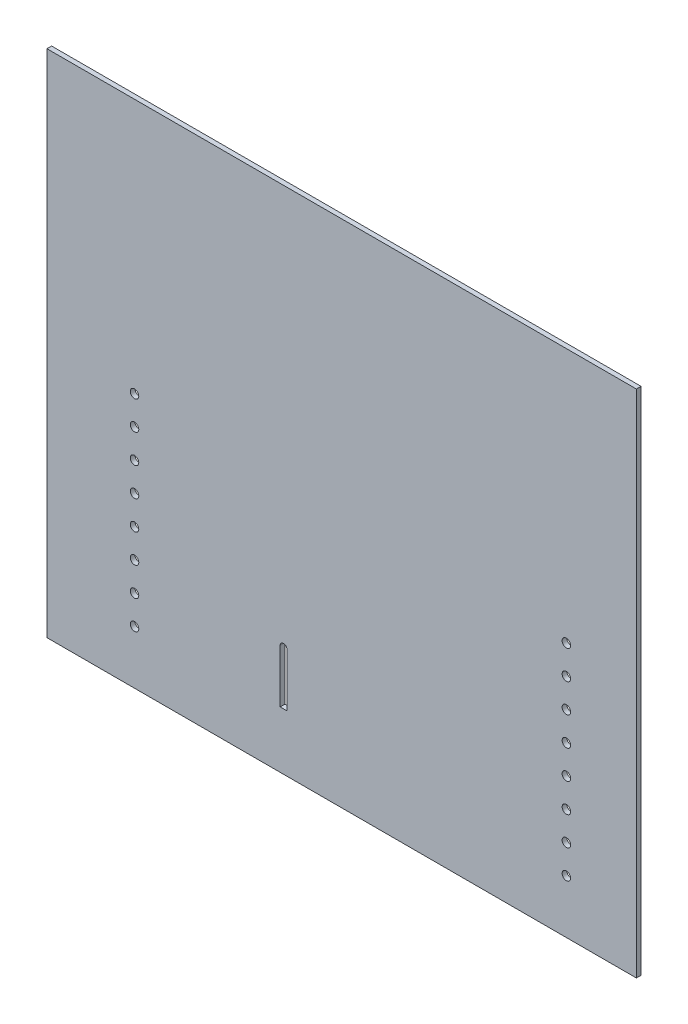
ISO-10303-21;
HEADER;
FILE_DESCRIPTION(('STEP AP214'),'2;1');
FILE_NAME('part.step','',(''),(''),'','','');
FILE_SCHEMA(('AUTOMOTIVE_DESIGN { 1 0 10303 214 1 1 1 1 }'));
ENDSEC;
DATA;
#1=APPLICATION_CONTEXT('core data for automotive mechanical design processes');
#2=APPLICATION_PROTOCOL_DEFINITION('international standard','automotive_design',2000,#1);
#3=PRODUCT_CONTEXT('',#1,'mechanical');
#4=PRODUCT('Part','Part','',(#3));
#5=PRODUCT_RELATED_PRODUCT_CATEGORY('part','',(#4));
#6=PRODUCT_DEFINITION_FORMATION('','',#4);
#7=PRODUCT_DEFINITION_CONTEXT('part definition',#1,'design');
#8=PRODUCT_DEFINITION('design','',#6,#7);
#9=PRODUCT_DEFINITION_SHAPE('','',#8);
#10=(LENGTH_UNIT() NAMED_UNIT(*) SI_UNIT(.MILLI.,.METRE.));
#11=(NAMED_UNIT(*) PLANE_ANGLE_UNIT() SI_UNIT($,.RADIAN.));
#12=(NAMED_UNIT(*) SI_UNIT($,.STERADIAN.) SOLID_ANGLE_UNIT());
#13=UNCERTAINTY_MEASURE_WITH_UNIT(LENGTH_MEASURE(1.E-05),#10,'distance_accuracy_value','');
#14=(GEOMETRIC_REPRESENTATION_CONTEXT(3) GLOBAL_UNCERTAINTY_ASSIGNED_CONTEXT((#13)) GLOBAL_UNIT_ASSIGNED_CONTEXT((#10,
#11,#12)) REPRESENTATION_CONTEXT('',''));
#15=CARTESIAN_POINT('',(0.,0.,0.));
#16=DIRECTION('',(0.,0.,1.));
#17=DIRECTION('',(1.,0.,0.));
#18=AXIS2_PLACEMENT_3D('',#15,#16,#17);
#19=CARTESIAN_POINT('',(52.,0.,0.41148));
#20=DIRECTION('',(0.,1.,0.));
#21=DIRECTION('',(0.,0.,1.));
#22=AXIS2_PLACEMENT_3D('',#19,#20,#21);
#23=PLANE('',#22);
#24=DIRECTION('',(1.,0.,0.));
#25=VECTOR('',#24,1.);
#26=CARTESIAN_POINT('',(52.,0.,0.));
#27=LINE('',#26,#25);
#28=CARTESIAN_POINT('',(0.,0.,0.));
#29=VERTEX_POINT('',#28);
#30=CARTESIAN_POINT('',(52.,0.,0.));
#31=VERTEX_POINT('',#30);
#32=EDGE_CURVE('E287',#29,#31,#27,.T.);
#33=ORIENTED_EDGE('',*,*,#32,.T.);
#34=DIRECTION('',(0.,0.,-1.));
#35=VECTOR('',#34,1.);
#36=CARTESIAN_POINT('',(52.,0.,0.41148));
#37=LINE('',#36,#35);
#38=CARTESIAN_POINT('',(52.,0.,0.41148));
#39=VERTEX_POINT('',#38);
#40=EDGE_CURVE('E11',#39,#31,#37,.T.);
#41=ORIENTED_EDGE('',*,*,#40,.F.);
#42=DIRECTION('',(1.,0.,0.));
#43=VECTOR('',#42,1.);
#44=CARTESIAN_POINT('',(52.,0.,0.41148));
#45=LINE('',#44,#43);
#46=CARTESIAN_POINT('',(0.,0.,0.41148));
#47=VERTEX_POINT('',#46);
#48=EDGE_CURVE('E288',#47,#39,#45,.T.);
#49=ORIENTED_EDGE('',*,*,#48,.F.);
#50=DIRECTION('',(0.,0.,-1.));
#51=VECTOR('',#50,1.);
#52=CARTESIAN_POINT('',(0.,0.,0.41148));
#53=LINE('',#52,#51);
#54=EDGE_CURVE('E302',#47,#29,#53,.T.);
#55=ORIENTED_EDGE('',*,*,#54,.T.);
#56=EDGE_LOOP('',(#33,#41,#49,#55));
#57=FACE_BOUND('',#56,.T.);
#58=ADVANCED_FACE('F46',(#57),#23,.F.);
#59=CARTESIAN_POINT('',(52.,45.,0.41148));
#60=DIRECTION('',(-1.,0.,0.));
#61=DIRECTION('',(0.,0.,1.));
#62=AXIS2_PLACEMENT_3D('',#59,#60,#61);
#63=PLANE('',#62);
#64=DIRECTION('',(0.,1.,0.));
#65=VECTOR('',#64,1.);
#66=CARTESIAN_POINT('',(52.,45.,0.));
#67=LINE('',#66,#65);
#68=CARTESIAN_POINT('',(52.,45.,0.));
#69=VERTEX_POINT('',#68);
#70=EDGE_CURVE('E306',#31,#69,#67,.T.);
#71=ORIENTED_EDGE('',*,*,#70,.T.);
#72=DIRECTION('',(0.,0.,-1.));
#73=VECTOR('',#72,1.);
#74=CARTESIAN_POINT('',(52.,45.,0.41148));
#75=LINE('',#74,#73);
#76=CARTESIAN_POINT('',(52.,45.,0.41148));
#77=VERTEX_POINT('',#76);
#78=EDGE_CURVE('E54',#77,#69,#75,.T.);
#79=ORIENTED_EDGE('',*,*,#78,.F.);
#80=DIRECTION('',(0.,1.,0.));
#81=VECTOR('',#80,1.);
#82=CARTESIAN_POINT('',(52.,45.,0.41148));
#83=LINE('',#82,#81);
#84=EDGE_CURVE('E292',#39,#77,#83,.T.);
#85=ORIENTED_EDGE('',*,*,#84,.F.);
#86=ORIENTED_EDGE('',*,*,#40,.T.);
#87=EDGE_LOOP('',(#71,#79,#85,#86));
#88=FACE_BOUND('',#87,.T.);
#89=ADVANCED_FACE('F341',(#88),#63,.F.);
#90=CARTESIAN_POINT('',(0.,45.,0.41148));
#91=DIRECTION('',(0.,-1.,0.));
#92=DIRECTION('',(0.,0.,-1.));
#93=AXIS2_PLACEMENT_3D('',#90,#91,#92);
#94=PLANE('',#93);
#95=DIRECTION('',(-1.,0.,0.));
#96=VECTOR('',#95,1.);
#97=CARTESIAN_POINT('',(0.,45.,0.));
#98=LINE('',#97,#96);
#99=CARTESIAN_POINT('',(0.,45.,0.));
#100=VERTEX_POINT('',#99);
#101=EDGE_CURVE('E309',#69,#100,#98,.T.);
#102=ORIENTED_EDGE('',*,*,#101,.T.);
#103=DIRECTION('',(0.,0.,-1.));
#104=VECTOR('',#103,1.);
#105=CARTESIAN_POINT('',(0.,45.,0.41148));
#106=LINE('',#105,#104);
#107=CARTESIAN_POINT('',(0.,45.,0.41148));
#108=VERTEX_POINT('',#107);
#109=EDGE_CURVE('E317',#108,#100,#106,.T.);
#110=ORIENTED_EDGE('',*,*,#109,.F.);
#111=DIRECTION('',(-1.,0.,0.));
#112=VECTOR('',#111,1.);
#113=CARTESIAN_POINT('',(0.,45.,0.41148));
#114=LINE('',#113,#112);
#115=EDGE_CURVE('E296',#77,#108,#114,.T.);
#116=ORIENTED_EDGE('',*,*,#115,.F.);
#117=ORIENTED_EDGE('',*,*,#78,.T.);
#118=EDGE_LOOP('',(#102,#110,#116,#117));
#119=FACE_BOUND('',#118,.T.);
#120=ADVANCED_FACE('F326',(#119),#94,.F.);
#121=CARTESIAN_POINT('',(0.,0.,0.41148));
#122=DIRECTION('',(1.,0.,0.));
#123=DIRECTION('',(0.,0.,-1.));
#124=AXIS2_PLACEMENT_3D('',#121,#122,#123);
#125=PLANE('',#124);
#126=DIRECTION('',(0.,-1.,0.));
#127=VECTOR('',#126,1.);
#128=CARTESIAN_POINT('',(0.,0.,0.));
#129=LINE('',#128,#127);
#130=EDGE_CURVE('E293',#100,#29,#129,.T.);
#131=ORIENTED_EDGE('',*,*,#130,.T.);
#132=ORIENTED_EDGE('',*,*,#54,.F.);
#133=DIRECTION('',(0.,-1.,0.));
#134=VECTOR('',#133,1.);
#135=CARTESIAN_POINT('',(0.,0.,0.41148));
#136=LINE('',#135,#134);
#137=EDGE_CURVE('E299',#108,#47,#136,.T.);
#138=ORIENTED_EDGE('',*,*,#137,.F.);
#139=ORIENTED_EDGE('',*,*,#109,.T.);
#140=EDGE_LOOP('',(#131,#132,#138,#139));
#141=FACE_BOUND('',#140,.T.);
#142=ADVANCED_FACE('F334',(#141),#125,.F.);
#143=CARTESIAN_POINT('',(0.,0.,0.41148));
#144=DIRECTION('',(0.,0.,-1.));
#145=DIRECTION('',(-1.,0.,0.));
#146=AXIS2_PLACEMENT_3D('',#143,#144,#145);
#147=PLANE('',#146);
#148=DIRECTION('',(0.,-1.,0.));
#149=VECTOR('',#148,1.);
#150=CARTESIAN_POINT('',(20.575,5.,0.41148));
#151=LINE('',#150,#149);
#152=CARTESIAN_POINT('',(20.575,9.7,0.41148));
#153=VERTEX_POINT('',#152);
#154=CARTESIAN_POINT('',(20.575,5.,0.41148));
#155=VERTEX_POINT('',#154);
#156=EDGE_CURVE('E145',#153,#155,#151,.T.);
#157=ORIENTED_EDGE('',*,*,#156,.F.);
#158=CARTESIAN_POINT('',(20.875,9.7,0.41148));
#159=DIRECTION('',(0.,0.,1.));
#160=DIRECTION('',(-1.,0.,0.));
#161=AXIS2_PLACEMENT_3D('',#158,#159,#160);
#162=CIRCLE('',#161,0.300000000000002);
#163=CARTESIAN_POINT('',(21.175,9.7,0.41148));
#164=VERTEX_POINT('',#163);
#165=EDGE_CURVE('E61',#164,#153,#162,.T.);
#166=ORIENTED_EDGE('',*,*,#165,.F.);
#167=DIRECTION('',(0.,1.,0.));
#168=VECTOR('',#167,1.);
#169=CARTESIAN_POINT('',(21.175,9.7,0.41148));
#170=LINE('',#169,#168);
#171=CARTESIAN_POINT('',(21.175,5.,0.41148));
#172=VERTEX_POINT('',#171);
#173=EDGE_CURVE('E132',#172,#164,#170,.T.);
#174=ORIENTED_EDGE('',*,*,#173,.F.);
#175=DIRECTION('',(1.,0.,0.));
#176=VECTOR('',#175,1.);
#177=CARTESIAN_POINT('',(21.175,5.,0.41148));
#178=LINE('',#177,#176);
#179=EDGE_CURVE('E136',#155,#172,#178,.T.);
#180=ORIENTED_EDGE('',*,*,#179,.F.);
#181=EDGE_LOOP('',(#157,#166,#174,#180));
#182=FACE_BOUND('',#181,.T.);
#183=CARTESIAN_POINT('',(7.725,4.72,0.411480000000006));
#184=DIRECTION('',(0.,0.,-1.));
#185=DIRECTION('',(-1.,0.,0.));
#186=AXIS2_PLACEMENT_3D('',#183,#184,#185);
#187=CIRCLE('',#186,0.374999999999987);
#188=CARTESIAN_POINT('',(7.35000000000001,4.72,0.411480000000006));
#189=VERTEX_POINT('',#188);
#190=EDGE_CURVE('E163',#189,#189,#187,.T.);
#191=ORIENTED_EDGE('',*,*,#190,.T.);
#192=EDGE_LOOP('',(#191));
#193=FACE_BOUND('',#192,.T.);
#194=CARTESIAN_POINT('',(7.725,7.26,0.411480000000006));
#195=DIRECTION('',(0.,0.,-1.));
#196=DIRECTION('',(-1.,0.,0.));
#197=AXIS2_PLACEMENT_3D('',#194,#195,#196);
#198=CIRCLE('',#197,0.374999999999987);
#199=CARTESIAN_POINT('',(7.35000000000001,7.26,0.411480000000006));
#200=VERTEX_POINT('',#199);
#201=EDGE_CURVE('E171',#200,#200,#198,.T.);
#202=ORIENTED_EDGE('',*,*,#201,.T.);
#203=EDGE_LOOP('',(#202));
#204=FACE_BOUND('',#203,.T.);
#205=CARTESIAN_POINT('',(7.725,9.8,0.411480000000006));
#206=DIRECTION('',(0.,0.,-1.));
#207=DIRECTION('',(-1.,0.,0.));
#208=AXIS2_PLACEMENT_3D('',#205,#206,#207);
#209=CIRCLE('',#208,0.374999999999987);
#210=CARTESIAN_POINT('',(7.35000000000001,9.8,0.411480000000006));
#211=VERTEX_POINT('',#210);
#212=EDGE_CURVE('E179',#211,#211,#209,.T.);
#213=ORIENTED_EDGE('',*,*,#212,.T.);
#214=EDGE_LOOP('',(#213));
#215=FACE_BOUND('',#214,.T.);
#216=CARTESIAN_POINT('',(7.725,12.34,0.411480000000006));
#217=DIRECTION('',(0.,0.,-1.));
#218=DIRECTION('',(-1.,0.,0.));
#219=AXIS2_PLACEMENT_3D('',#216,#217,#218);
#220=CIRCLE('',#219,0.374999999999987);
#221=CARTESIAN_POINT('',(7.35000000000001,12.34,0.411480000000006));
#222=VERTEX_POINT('',#221);
#223=EDGE_CURVE('E187',#222,#222,#220,.T.);
#224=ORIENTED_EDGE('',*,*,#223,.T.);
#225=EDGE_LOOP('',(#224));
#226=FACE_BOUND('',#225,.T.);
#227=CARTESIAN_POINT('',(7.725,14.88,0.411480000000006));
#228=DIRECTION('',(0.,0.,-1.));
#229=DIRECTION('',(-1.,0.,0.));
#230=AXIS2_PLACEMENT_3D('',#227,#228,#229);
#231=CIRCLE('',#230,0.374999999999987);
#232=CARTESIAN_POINT('',(7.35000000000001,14.88,0.411480000000006));
#233=VERTEX_POINT('',#232);
#234=EDGE_CURVE('E195',#233,#233,#231,.T.);
#235=ORIENTED_EDGE('',*,*,#234,.T.);
#236=EDGE_LOOP('',(#235));
#237=FACE_BOUND('',#236,.T.);
#238=CARTESIAN_POINT('',(7.725,17.42,0.411480000000006));
#239=DIRECTION('',(0.,0.,-1.));
#240=DIRECTION('',(-1.,0.,0.));
#241=AXIS2_PLACEMENT_3D('',#238,#239,#240);
#242=CIRCLE('',#241,0.374999999999987);
#243=CARTESIAN_POINT('',(7.35000000000001,17.42,0.411480000000006));
#244=VERTEX_POINT('',#243);
#245=EDGE_CURVE('E203',#244,#244,#242,.T.);
#246=ORIENTED_EDGE('',*,*,#245,.T.);
#247=EDGE_LOOP('',(#246));
#248=FACE_BOUND('',#247,.T.);
#249=CARTESIAN_POINT('',(7.725,19.96,0.411480000000006));
#250=DIRECTION('',(0.,0.,-1.));
#251=DIRECTION('',(-1.,0.,0.));
#252=AXIS2_PLACEMENT_3D('',#249,#250,#251);
#253=CIRCLE('',#252,0.374999999999987);
#254=CARTESIAN_POINT('',(7.35000000000001,19.96,0.411480000000006));
#255=VERTEX_POINT('',#254);
#256=EDGE_CURVE('E211',#255,#255,#253,.T.);
#257=ORIENTED_EDGE('',*,*,#256,.T.);
#258=EDGE_LOOP('',(#257));
#259=FACE_BOUND('',#258,.T.);
#260=CARTESIAN_POINT('',(7.725,22.5,0.411480000000006));
#261=DIRECTION('',(0.,0.,-1.));
#262=DIRECTION('',(-1.,0.,0.));
#263=AXIS2_PLACEMENT_3D('',#260,#261,#262);
#264=CIRCLE('',#263,0.374999999999987);
#265=CARTESIAN_POINT('',(7.35000000000001,22.5,0.411480000000006));
#266=VERTEX_POINT('',#265);
#267=EDGE_CURVE('E219',#266,#266,#264,.T.);
#268=ORIENTED_EDGE('',*,*,#267,.T.);
#269=EDGE_LOOP('',(#268));
#270=FACE_BOUND('',#269,.T.);
#271=CARTESIAN_POINT('',(45.825,4.72,0.411480000000006));
#272=DIRECTION('',(0.,0.,-1.));
#273=DIRECTION('',(-1.,0.,0.));
#274=AXIS2_PLACEMENT_3D('',#271,#272,#273);
#275=CIRCLE('',#274,0.374999999999986);
#276=CARTESIAN_POINT('',(45.45,4.72,0.411480000000006));
#277=VERTEX_POINT('',#276);
#278=EDGE_CURVE('E227',#277,#277,#275,.T.);
#279=ORIENTED_EDGE('',*,*,#278,.T.);
#280=EDGE_LOOP('',(#279));
#281=FACE_BOUND('',#280,.T.);
#282=CARTESIAN_POINT('',(45.825,7.26,0.411480000000006));
#283=DIRECTION('',(0.,0.,-1.));
#284=DIRECTION('',(-1.,0.,0.));
#285=AXIS2_PLACEMENT_3D('',#282,#283,#284);
#286=CIRCLE('',#285,0.374999999999986);
#287=CARTESIAN_POINT('',(45.45,7.26,0.411480000000006));
#288=VERTEX_POINT('',#287);
#289=EDGE_CURVE('E235',#288,#288,#286,.T.);
#290=ORIENTED_EDGE('',*,*,#289,.T.);
#291=EDGE_LOOP('',(#290));
#292=FACE_BOUND('',#291,.T.);
#293=CARTESIAN_POINT('',(45.825,9.8,0.411480000000006));
#294=DIRECTION('',(0.,0.,-1.));
#295=DIRECTION('',(-1.,0.,0.));
#296=AXIS2_PLACEMENT_3D('',#293,#294,#295);
#297=CIRCLE('',#296,0.374999999999986);
#298=CARTESIAN_POINT('',(45.45,9.8,0.411480000000006));
#299=VERTEX_POINT('',#298);
#300=EDGE_CURVE('E243',#299,#299,#297,.T.);
#301=ORIENTED_EDGE('',*,*,#300,.T.);
#302=EDGE_LOOP('',(#301));
#303=FACE_BOUND('',#302,.T.);
#304=CARTESIAN_POINT('',(45.825,12.34,0.411480000000006));
#305=DIRECTION('',(0.,0.,-1.));
#306=DIRECTION('',(-1.,0.,0.));
#307=AXIS2_PLACEMENT_3D('',#304,#305,#306);
#308=CIRCLE('',#307,0.374999999999986);
#309=CARTESIAN_POINT('',(45.45,12.34,0.411480000000006));
#310=VERTEX_POINT('',#309);
#311=EDGE_CURVE('E251',#310,#310,#308,.T.);
#312=ORIENTED_EDGE('',*,*,#311,.T.);
#313=EDGE_LOOP('',(#312));
#314=FACE_BOUND('',#313,.T.);
#315=CARTESIAN_POINT('',(45.825,14.88,0.411480000000006));
#316=DIRECTION('',(0.,0.,-1.));
#317=DIRECTION('',(-1.,0.,0.));
#318=AXIS2_PLACEMENT_3D('',#315,#316,#317);
#319=CIRCLE('',#318,0.374999999999986);
#320=CARTESIAN_POINT('',(45.45,14.88,0.411480000000006));
#321=VERTEX_POINT('',#320);
#322=EDGE_CURVE('E259',#321,#321,#319,.T.);
#323=ORIENTED_EDGE('',*,*,#322,.T.);
#324=EDGE_LOOP('',(#323));
#325=FACE_BOUND('',#324,.T.);
#326=CARTESIAN_POINT('',(45.825,17.42,0.411480000000006));
#327=DIRECTION('',(0.,0.,-1.));
#328=DIRECTION('',(-1.,0.,0.));
#329=AXIS2_PLACEMENT_3D('',#326,#327,#328);
#330=CIRCLE('',#329,0.374999999999986);
#331=CARTESIAN_POINT('',(45.45,17.42,0.411480000000006));
#332=VERTEX_POINT('',#331);
#333=EDGE_CURVE('E267',#332,#332,#330,.T.);
#334=ORIENTED_EDGE('',*,*,#333,.T.);
#335=EDGE_LOOP('',(#334));
#336=FACE_BOUND('',#335,.T.);
#337=CARTESIAN_POINT('',(45.825,19.96,0.411480000000006));
#338=DIRECTION('',(0.,0.,-1.));
#339=DIRECTION('',(-1.,0.,0.));
#340=AXIS2_PLACEMENT_3D('',#337,#338,#339);
#341=CIRCLE('',#340,0.374999999999986);
#342=CARTESIAN_POINT('',(45.45,19.96,0.411480000000006));
#343=VERTEX_POINT('',#342);
#344=EDGE_CURVE('E275',#343,#343,#341,.T.);
#345=ORIENTED_EDGE('',*,*,#344,.T.);
#346=EDGE_LOOP('',(#345));
#347=FACE_BOUND('',#346,.T.);
#348=CARTESIAN_POINT('',(45.825,22.5,0.411480000000006));
#349=DIRECTION('',(0.,0.,-1.));
#350=DIRECTION('',(-1.,0.,0.));
#351=AXIS2_PLACEMENT_3D('',#348,#349,#350);
#352=CIRCLE('',#351,0.374999999999986);
#353=CARTESIAN_POINT('',(45.45,22.5,0.411480000000006));
#354=VERTEX_POINT('',#353);
#355=EDGE_CURVE('E283',#354,#354,#352,.T.);
#356=ORIENTED_EDGE('',*,*,#355,.T.);
#357=EDGE_LOOP('',(#356));
#358=FACE_BOUND('',#357,.T.);
#359=ORIENTED_EDGE('',*,*,#48,.T.);
#360=ORIENTED_EDGE('',*,*,#84,.T.);
#361=ORIENTED_EDGE('',*,*,#115,.T.);
#362=ORIENTED_EDGE('',*,*,#137,.T.);
#363=EDGE_LOOP('',(#359,#360,#361,#362));
#364=FACE_BOUND('',#363,.T.);
#365=ADVANCED_FACE('F340',(#182,#193,#204,#215,#226,#237,#248,#259,#270,#281,#292,#303,#314,
#325,#336,#347,#358,#364),#147,.F.);
#366=CARTESIAN_POINT('',(0.,0.,0.));
#367=DIRECTION('',(0.,0.,-1.));
#368=DIRECTION('',(-1.,0.,0.));
#369=AXIS2_PLACEMENT_3D('',#366,#367,#368);
#370=PLANE('',#369);
#371=CARTESIAN_POINT('',(20.875,9.7,0.));
#372=DIRECTION('',(0.,0.,1.));
#373=DIRECTION('',(-1.,0.,0.));
#374=AXIS2_PLACEMENT_3D('',#371,#372,#373);
#375=CIRCLE('',#374,0.300000000000002);
#376=CARTESIAN_POINT('',(21.175,9.7,0.));
#377=VERTEX_POINT('',#376);
#378=CARTESIAN_POINT('',(20.575,9.7,0.));
#379=VERTEX_POINT('',#378);
#380=EDGE_CURVE('E113',#377,#379,#375,.T.);
#381=ORIENTED_EDGE('',*,*,#380,.T.);
#382=DIRECTION('',(0.,-1.,0.));
#383=VECTOR('',#382,1.);
#384=CARTESIAN_POINT('',(20.575,5.,0.));
#385=LINE('',#384,#383);
#386=CARTESIAN_POINT('',(20.575,5.,0.));
#387=VERTEX_POINT('',#386);
#388=EDGE_CURVE('E123',#379,#387,#385,.T.);
#389=ORIENTED_EDGE('',*,*,#388,.T.);
#390=DIRECTION('',(1.,0.,0.));
#391=VECTOR('',#390,1.);
#392=CARTESIAN_POINT('',(21.175,5.,0.));
#393=LINE('',#392,#391);
#394=CARTESIAN_POINT('',(21.175,5.,0.));
#395=VERTEX_POINT('',#394);
#396=EDGE_CURVE('E69',#387,#395,#393,.T.);
#397=ORIENTED_EDGE('',*,*,#396,.T.);
#398=DIRECTION('',(0.,1.,0.));
#399=VECTOR('',#398,1.);
#400=CARTESIAN_POINT('',(21.175,9.7,0.));
#401=LINE('',#400,#399);
#402=EDGE_CURVE('E120',#395,#377,#401,.T.);
#403=ORIENTED_EDGE('',*,*,#402,.T.);
#404=EDGE_LOOP('',(#381,#389,#397,#403));
#405=FACE_BOUND('',#404,.T.);
#406=CARTESIAN_POINT('',(7.725,4.72,0.));
#407=DIRECTION('',(0.,0.,-1.));
#408=DIRECTION('',(-1.,0.,0.));
#409=AXIS2_PLACEMENT_3D('',#406,#407,#408);
#410=CIRCLE('',#409,0.374999999999989);
#411=CARTESIAN_POINT('',(7.35000000000001,4.72,0.));
#412=VERTEX_POINT('',#411);
#413=EDGE_CURVE('E154',#412,#412,#410,.T.);
#414=ORIENTED_EDGE('',*,*,#413,.F.);
#415=EDGE_LOOP('',(#414));
#416=FACE_BOUND('',#415,.T.);
#417=CARTESIAN_POINT('',(7.725,7.26,0.));
#418=DIRECTION('',(0.,0.,-1.));
#419=DIRECTION('',(-1.,0.,0.));
#420=AXIS2_PLACEMENT_3D('',#417,#418,#419);
#421=CIRCLE('',#420,0.374999999999989);
#422=CARTESIAN_POINT('',(7.35000000000001,7.26,0.));
#423=VERTEX_POINT('',#422);
#424=EDGE_CURVE('E167',#423,#423,#421,.T.);
#425=ORIENTED_EDGE('',*,*,#424,.F.);
#426=EDGE_LOOP('',(#425));
#427=FACE_BOUND('',#426,.T.);
#428=CARTESIAN_POINT('',(7.725,9.8,0.));
#429=DIRECTION('',(0.,0.,-1.));
#430=DIRECTION('',(-1.,0.,0.));
#431=AXIS2_PLACEMENT_3D('',#428,#429,#430);
#432=CIRCLE('',#431,0.374999999999989);
#433=CARTESIAN_POINT('',(7.35000000000001,9.8,0.));
#434=VERTEX_POINT('',#433);
#435=EDGE_CURVE('E175',#434,#434,#432,.T.);
#436=ORIENTED_EDGE('',*,*,#435,.F.);
#437=EDGE_LOOP('',(#436));
#438=FACE_BOUND('',#437,.T.);
#439=CARTESIAN_POINT('',(7.725,12.34,0.));
#440=DIRECTION('',(0.,0.,-1.));
#441=DIRECTION('',(-1.,0.,0.));
#442=AXIS2_PLACEMENT_3D('',#439,#440,#441);
#443=CIRCLE('',#442,0.374999999999989);
#444=CARTESIAN_POINT('',(7.35000000000001,12.34,0.));
#445=VERTEX_POINT('',#444);
#446=EDGE_CURVE('E183',#445,#445,#443,.T.);
#447=ORIENTED_EDGE('',*,*,#446,.F.);
#448=EDGE_LOOP('',(#447));
#449=FACE_BOUND('',#448,.T.);
#450=CARTESIAN_POINT('',(7.725,14.88,0.));
#451=DIRECTION('',(0.,0.,-1.));
#452=DIRECTION('',(-1.,0.,0.));
#453=AXIS2_PLACEMENT_3D('',#450,#451,#452);
#454=CIRCLE('',#453,0.374999999999989);
#455=CARTESIAN_POINT('',(7.35000000000001,14.88,0.));
#456=VERTEX_POINT('',#455);
#457=EDGE_CURVE('E191',#456,#456,#454,.T.);
#458=ORIENTED_EDGE('',*,*,#457,.F.);
#459=EDGE_LOOP('',(#458));
#460=FACE_BOUND('',#459,.T.);
#461=CARTESIAN_POINT('',(7.725,17.42,0.));
#462=DIRECTION('',(0.,0.,-1.));
#463=DIRECTION('',(-1.,0.,0.));
#464=AXIS2_PLACEMENT_3D('',#461,#462,#463);
#465=CIRCLE('',#464,0.374999999999989);
#466=CARTESIAN_POINT('',(7.35000000000001,17.42,0.));
#467=VERTEX_POINT('',#466);
#468=EDGE_CURVE('E199',#467,#467,#465,.T.);
#469=ORIENTED_EDGE('',*,*,#468,.F.);
#470=EDGE_LOOP('',(#469));
#471=FACE_BOUND('',#470,.T.);
#472=CARTESIAN_POINT('',(7.725,19.96,0.));
#473=DIRECTION('',(0.,0.,-1.));
#474=DIRECTION('',(-1.,0.,0.));
#475=AXIS2_PLACEMENT_3D('',#472,#473,#474);
#476=CIRCLE('',#475,0.374999999999989);
#477=CARTESIAN_POINT('',(7.35000000000001,19.96,0.));
#478=VERTEX_POINT('',#477);
#479=EDGE_CURVE('E207',#478,#478,#476,.T.);
#480=ORIENTED_EDGE('',*,*,#479,.F.);
#481=EDGE_LOOP('',(#480));
#482=FACE_BOUND('',#481,.T.);
#483=CARTESIAN_POINT('',(7.725,22.5,0.));
#484=DIRECTION('',(0.,0.,-1.));
#485=DIRECTION('',(-1.,0.,0.));
#486=AXIS2_PLACEMENT_3D('',#483,#484,#485);
#487=CIRCLE('',#486,0.374999999999989);
#488=CARTESIAN_POINT('',(7.35000000000001,22.5,0.));
#489=VERTEX_POINT('',#488);
#490=EDGE_CURVE('E215',#489,#489,#487,.T.);
#491=ORIENTED_EDGE('',*,*,#490,.F.);
#492=EDGE_LOOP('',(#491));
#493=FACE_BOUND('',#492,.T.);
#494=CARTESIAN_POINT('',(45.825,4.72,0.));
#495=DIRECTION('',(0.,0.,-1.));
#496=DIRECTION('',(-1.,0.,0.));
#497=AXIS2_PLACEMENT_3D('',#494,#495,#496);
#498=CIRCLE('',#497,0.374999999999986);
#499=CARTESIAN_POINT('',(45.45,4.72,0.));
#500=VERTEX_POINT('',#499);
#501=EDGE_CURVE('E223',#500,#500,#498,.T.);
#502=ORIENTED_EDGE('',*,*,#501,.F.);
#503=EDGE_LOOP('',(#502));
#504=FACE_BOUND('',#503,.T.);
#505=CARTESIAN_POINT('',(45.825,7.26,0.));
#506=DIRECTION('',(0.,0.,-1.));
#507=DIRECTION('',(-1.,0.,0.));
#508=AXIS2_PLACEMENT_3D('',#505,#506,#507);
#509=CIRCLE('',#508,0.374999999999986);
#510=CARTESIAN_POINT('',(45.45,7.26,0.));
#511=VERTEX_POINT('',#510);
#512=EDGE_CURVE('E231',#511,#511,#509,.T.);
#513=ORIENTED_EDGE('',*,*,#512,.F.);
#514=EDGE_LOOP('',(#513));
#515=FACE_BOUND('',#514,.T.);
#516=CARTESIAN_POINT('',(45.825,9.8,0.));
#517=DIRECTION('',(0.,0.,-1.));
#518=DIRECTION('',(-1.,0.,0.));
#519=AXIS2_PLACEMENT_3D('',#516,#517,#518);
#520=CIRCLE('',#519,0.374999999999986);
#521=CARTESIAN_POINT('',(45.45,9.8,0.));
#522=VERTEX_POINT('',#521);
#523=EDGE_CURVE('E239',#522,#522,#520,.T.);
#524=ORIENTED_EDGE('',*,*,#523,.F.);
#525=EDGE_LOOP('',(#524));
#526=FACE_BOUND('',#525,.T.);
#527=CARTESIAN_POINT('',(45.825,12.34,0.));
#528=DIRECTION('',(0.,0.,-1.));
#529=DIRECTION('',(-1.,0.,0.));
#530=AXIS2_PLACEMENT_3D('',#527,#528,#529);
#531=CIRCLE('',#530,0.374999999999986);
#532=CARTESIAN_POINT('',(45.45,12.34,0.));
#533=VERTEX_POINT('',#532);
#534=EDGE_CURVE('E247',#533,#533,#531,.T.);
#535=ORIENTED_EDGE('',*,*,#534,.F.);
#536=EDGE_LOOP('',(#535));
#537=FACE_BOUND('',#536,.T.);
#538=CARTESIAN_POINT('',(45.825,14.88,0.));
#539=DIRECTION('',(0.,0.,-1.));
#540=DIRECTION('',(-1.,0.,0.));
#541=AXIS2_PLACEMENT_3D('',#538,#539,#540);
#542=CIRCLE('',#541,0.374999999999986);
#543=CARTESIAN_POINT('',(45.45,14.88,0.));
#544=VERTEX_POINT('',#543);
#545=EDGE_CURVE('E255',#544,#544,#542,.T.);
#546=ORIENTED_EDGE('',*,*,#545,.F.);
#547=EDGE_LOOP('',(#546));
#548=FACE_BOUND('',#547,.T.);
#549=CARTESIAN_POINT('',(45.825,17.42,0.));
#550=DIRECTION('',(0.,0.,-1.));
#551=DIRECTION('',(-1.,0.,0.));
#552=AXIS2_PLACEMENT_3D('',#549,#550,#551);
#553=CIRCLE('',#552,0.374999999999986);
#554=CARTESIAN_POINT('',(45.45,17.42,0.));
#555=VERTEX_POINT('',#554);
#556=EDGE_CURVE('E263',#555,#555,#553,.T.);
#557=ORIENTED_EDGE('',*,*,#556,.F.);
#558=EDGE_LOOP('',(#557));
#559=FACE_BOUND('',#558,.T.);
#560=CARTESIAN_POINT('',(45.825,19.96,0.));
#561=DIRECTION('',(0.,0.,-1.));
#562=DIRECTION('',(-1.,0.,0.));
#563=AXIS2_PLACEMENT_3D('',#560,#561,#562);
#564=CIRCLE('',#563,0.374999999999986);
#565=CARTESIAN_POINT('',(45.45,19.96,0.));
#566=VERTEX_POINT('',#565);
#567=EDGE_CURVE('E271',#566,#566,#564,.T.);
#568=ORIENTED_EDGE('',*,*,#567,.F.);
#569=EDGE_LOOP('',(#568));
#570=FACE_BOUND('',#569,.T.);
#571=CARTESIAN_POINT('',(45.825,22.5,0.));
#572=DIRECTION('',(0.,0.,-1.));
#573=DIRECTION('',(-1.,0.,0.));
#574=AXIS2_PLACEMENT_3D('',#571,#572,#573);
#575=CIRCLE('',#574,0.374999999999986);
#576=CARTESIAN_POINT('',(45.45,22.5,0.));
#577=VERTEX_POINT('',#576);
#578=EDGE_CURVE('E279',#577,#577,#575,.T.);
#579=ORIENTED_EDGE('',*,*,#578,.F.);
#580=EDGE_LOOP('',(#579));
#581=FACE_BOUND('',#580,.T.);
#582=ORIENTED_EDGE('',*,*,#32,.F.);
#583=ORIENTED_EDGE('',*,*,#130,.F.);
#584=ORIENTED_EDGE('',*,*,#101,.F.);
#585=ORIENTED_EDGE('',*,*,#70,.F.);
#586=EDGE_LOOP('',(#582,#583,#584,#585));
#587=FACE_BOUND('',#586,.T.);
#588=ADVANCED_FACE('F128',(#405,#416,#427,#438,#449,#460,#471,#482,#493,#504,#515,#526,#537,
#548,#559,#570,#581,#587),#370,.T.);
#589=CARTESIAN_POINT('',(45.825,22.5,0.));
#590=DIRECTION('',(0.,0.,-1.));
#591=DIRECTION('',(-1.,0.,0.));
#592=AXIS2_PLACEMENT_3D('',#589,#590,#591);
#593=CYLINDRICAL_SURFACE('',#592,0.374999999999986);
#594=ORIENTED_EDGE('',*,*,#355,.F.);
#595=EDGE_LOOP('',(#594));
#596=FACE_BOUND('',#595,.T.);
#597=ORIENTED_EDGE('',*,*,#578,.T.);
#598=EDGE_LOOP('',(#597));
#599=FACE_BOUND('',#598,.T.);
#600=ADVANCED_FACE('F353',(#596,#599),#593,.F.);
#601=CARTESIAN_POINT('',(45.825,19.96,0.));
#602=DIRECTION('',(0.,0.,-1.));
#603=DIRECTION('',(-1.,0.,0.));
#604=AXIS2_PLACEMENT_3D('',#601,#602,#603);
#605=CYLINDRICAL_SURFACE('',#604,0.374999999999986);
#606=ORIENTED_EDGE('',*,*,#344,.F.);
#607=EDGE_LOOP('',(#606));
#608=FACE_BOUND('',#607,.T.);
#609=ORIENTED_EDGE('',*,*,#567,.T.);
#610=EDGE_LOOP('',(#609));
#611=FACE_BOUND('',#610,.T.);
#612=ADVANCED_FACE('F359',(#608,#611),#605,.F.);
#613=CARTESIAN_POINT('',(45.825,17.42,0.));
#614=DIRECTION('',(0.,0.,-1.));
#615=DIRECTION('',(-1.,0.,0.));
#616=AXIS2_PLACEMENT_3D('',#613,#614,#615);
#617=CYLINDRICAL_SURFACE('',#616,0.374999999999986);
#618=ORIENTED_EDGE('',*,*,#333,.F.);
#619=EDGE_LOOP('',(#618));
#620=FACE_BOUND('',#619,.T.);
#621=ORIENTED_EDGE('',*,*,#556,.T.);
#622=EDGE_LOOP('',(#621));
#623=FACE_BOUND('',#622,.T.);
#624=ADVANCED_FACE('F363',(#620,#623),#617,.F.);
#625=CARTESIAN_POINT('',(45.825,14.88,0.));
#626=DIRECTION('',(0.,0.,-1.));
#627=DIRECTION('',(-1.,0.,0.));
#628=AXIS2_PLACEMENT_3D('',#625,#626,#627);
#629=CYLINDRICAL_SURFACE('',#628,0.374999999999986);
#630=ORIENTED_EDGE('',*,*,#322,.F.);
#631=EDGE_LOOP('',(#630));
#632=FACE_BOUND('',#631,.T.);
#633=ORIENTED_EDGE('',*,*,#545,.T.);
#634=EDGE_LOOP('',(#633));
#635=FACE_BOUND('',#634,.T.);
#636=ADVANCED_FACE('F367',(#632,#635),#629,.F.);
#637=CARTESIAN_POINT('',(45.825,12.34,0.));
#638=DIRECTION('',(0.,0.,-1.));
#639=DIRECTION('',(-1.,0.,0.));
#640=AXIS2_PLACEMENT_3D('',#637,#638,#639);
#641=CYLINDRICAL_SURFACE('',#640,0.374999999999986);
#642=ORIENTED_EDGE('',*,*,#311,.F.);
#643=EDGE_LOOP('',(#642));
#644=FACE_BOUND('',#643,.T.);
#645=ORIENTED_EDGE('',*,*,#534,.T.);
#646=EDGE_LOOP('',(#645));
#647=FACE_BOUND('',#646,.T.);
#648=ADVANCED_FACE('F371',(#644,#647),#641,.F.);
#649=CARTESIAN_POINT('',(45.825,9.8,0.));
#650=DIRECTION('',(0.,0.,-1.));
#651=DIRECTION('',(-1.,0.,0.));
#652=AXIS2_PLACEMENT_3D('',#649,#650,#651);
#653=CYLINDRICAL_SURFACE('',#652,0.374999999999986);
#654=ORIENTED_EDGE('',*,*,#300,.F.);
#655=EDGE_LOOP('',(#654));
#656=FACE_BOUND('',#655,.T.);
#657=ORIENTED_EDGE('',*,*,#523,.T.);
#658=EDGE_LOOP('',(#657));
#659=FACE_BOUND('',#658,.T.);
#660=ADVANCED_FACE('F375',(#656,#659),#653,.F.);
#661=CARTESIAN_POINT('',(45.825,7.26,0.));
#662=DIRECTION('',(0.,0.,-1.));
#663=DIRECTION('',(-1.,0.,0.));
#664=AXIS2_PLACEMENT_3D('',#661,#662,#663);
#665=CYLINDRICAL_SURFACE('',#664,0.374999999999986);
#666=ORIENTED_EDGE('',*,*,#289,.F.);
#667=EDGE_LOOP('',(#666));
#668=FACE_BOUND('',#667,.T.);
#669=ORIENTED_EDGE('',*,*,#512,.T.);
#670=EDGE_LOOP('',(#669));
#671=FACE_BOUND('',#670,.T.);
#672=ADVANCED_FACE('F379',(#668,#671),#665,.F.);
#673=CARTESIAN_POINT('',(45.825,4.72,0.));
#674=DIRECTION('',(0.,0.,-1.));
#675=DIRECTION('',(-1.,0.,0.));
#676=AXIS2_PLACEMENT_3D('',#673,#674,#675);
#677=CYLINDRICAL_SURFACE('',#676,0.374999999999986);
#678=ORIENTED_EDGE('',*,*,#278,.F.);
#679=EDGE_LOOP('',(#678));
#680=FACE_BOUND('',#679,.T.);
#681=ORIENTED_EDGE('',*,*,#501,.T.);
#682=EDGE_LOOP('',(#681));
#683=FACE_BOUND('',#682,.T.);
#684=ADVANCED_FACE('F383',(#680,#683),#677,.F.);
#685=CARTESIAN_POINT('',(7.725,22.5,0.));
#686=DIRECTION('',(0.,0.,-1.));
#687=DIRECTION('',(-1.,0.,0.));
#688=AXIS2_PLACEMENT_3D('',#685,#686,#687);
#689=CYLINDRICAL_SURFACE('',#688,0.374999999999988);
#690=ORIENTED_EDGE('',*,*,#267,.F.);
#691=EDGE_LOOP('',(#690));
#692=FACE_BOUND('',#691,.T.);
#693=ORIENTED_EDGE('',*,*,#490,.T.);
#694=EDGE_LOOP('',(#693));
#695=FACE_BOUND('',#694,.T.);
#696=ADVANCED_FACE('F387',(#692,#695),#689,.F.);
#697=CARTESIAN_POINT('',(7.725,19.96,0.));
#698=DIRECTION('',(0.,0.,-1.));
#699=DIRECTION('',(-1.,0.,0.));
#700=AXIS2_PLACEMENT_3D('',#697,#698,#699);
#701=CYLINDRICAL_SURFACE('',#700,0.374999999999988);
#702=ORIENTED_EDGE('',*,*,#256,.F.);
#703=EDGE_LOOP('',(#702));
#704=FACE_BOUND('',#703,.T.);
#705=ORIENTED_EDGE('',*,*,#479,.T.);
#706=EDGE_LOOP('',(#705));
#707=FACE_BOUND('',#706,.T.);
#708=ADVANCED_FACE('F391',(#704,#707),#701,.F.);
#709=CARTESIAN_POINT('',(7.725,17.42,0.));
#710=DIRECTION('',(0.,0.,-1.));
#711=DIRECTION('',(-1.,0.,0.));
#712=AXIS2_PLACEMENT_3D('',#709,#710,#711);
#713=CYLINDRICAL_SURFACE('',#712,0.374999999999988);
#714=ORIENTED_EDGE('',*,*,#245,.F.);
#715=EDGE_LOOP('',(#714));
#716=FACE_BOUND('',#715,.T.);
#717=ORIENTED_EDGE('',*,*,#468,.T.);
#718=EDGE_LOOP('',(#717));
#719=FACE_BOUND('',#718,.T.);
#720=ADVANCED_FACE('F395',(#716,#719),#713,.F.);
#721=CARTESIAN_POINT('',(7.725,14.88,0.));
#722=DIRECTION('',(0.,0.,-1.));
#723=DIRECTION('',(-1.,0.,0.));
#724=AXIS2_PLACEMENT_3D('',#721,#722,#723);
#725=CYLINDRICAL_SURFACE('',#724,0.374999999999988);
#726=ORIENTED_EDGE('',*,*,#234,.F.);
#727=EDGE_LOOP('',(#726));
#728=FACE_BOUND('',#727,.T.);
#729=ORIENTED_EDGE('',*,*,#457,.T.);
#730=EDGE_LOOP('',(#729));
#731=FACE_BOUND('',#730,.T.);
#732=ADVANCED_FACE('F399',(#728,#731),#725,.F.);
#733=CARTESIAN_POINT('',(7.725,12.34,0.));
#734=DIRECTION('',(0.,0.,-1.));
#735=DIRECTION('',(-1.,0.,0.));
#736=AXIS2_PLACEMENT_3D('',#733,#734,#735);
#737=CYLINDRICAL_SURFACE('',#736,0.374999999999988);
#738=ORIENTED_EDGE('',*,*,#223,.F.);
#739=EDGE_LOOP('',(#738));
#740=FACE_BOUND('',#739,.T.);
#741=ORIENTED_EDGE('',*,*,#446,.T.);
#742=EDGE_LOOP('',(#741));
#743=FACE_BOUND('',#742,.T.);
#744=ADVANCED_FACE('F403',(#740,#743),#737,.F.);
#745=CARTESIAN_POINT('',(7.725,9.8,0.));
#746=DIRECTION('',(0.,0.,-1.));
#747=DIRECTION('',(-1.,0.,0.));
#748=AXIS2_PLACEMENT_3D('',#745,#746,#747);
#749=CYLINDRICAL_SURFACE('',#748,0.374999999999988);
#750=ORIENTED_EDGE('',*,*,#212,.F.);
#751=EDGE_LOOP('',(#750));
#752=FACE_BOUND('',#751,.T.);
#753=ORIENTED_EDGE('',*,*,#435,.T.);
#754=EDGE_LOOP('',(#753));
#755=FACE_BOUND('',#754,.T.);
#756=ADVANCED_FACE('F407',(#752,#755),#749,.F.);
#757=CARTESIAN_POINT('',(7.725,7.26,0.));
#758=DIRECTION('',(0.,0.,-1.));
#759=DIRECTION('',(-1.,0.,0.));
#760=AXIS2_PLACEMENT_3D('',#757,#758,#759);
#761=CYLINDRICAL_SURFACE('',#760,0.374999999999988);
#762=ORIENTED_EDGE('',*,*,#201,.F.);
#763=EDGE_LOOP('',(#762));
#764=FACE_BOUND('',#763,.T.);
#765=ORIENTED_EDGE('',*,*,#424,.T.);
#766=EDGE_LOOP('',(#765));
#767=FACE_BOUND('',#766,.T.);
#768=ADVANCED_FACE('F411',(#764,#767),#761,.F.);
#769=CARTESIAN_POINT('',(7.725,4.72,0.));
#770=DIRECTION('',(0.,0.,-1.));
#771=DIRECTION('',(-1.,0.,0.));
#772=AXIS2_PLACEMENT_3D('',#769,#770,#771);
#773=CYLINDRICAL_SURFACE('',#772,0.374999999999988);
#774=ORIENTED_EDGE('',*,*,#190,.F.);
#775=EDGE_LOOP('',(#774));
#776=FACE_BOUND('',#775,.T.);
#777=ORIENTED_EDGE('',*,*,#413,.T.);
#778=EDGE_LOOP('',(#777));
#779=FACE_BOUND('',#778,.T.);
#780=ADVANCED_FACE('F415',(#776,#779),#773,.F.);
#781=CARTESIAN_POINT('',(20.875,9.7,0.));
#782=DIRECTION('',(0.,0.,1.));
#783=DIRECTION('',(1.,0.,0.));
#784=AXIS2_PLACEMENT_3D('',#781,#782,#783);
#785=CYLINDRICAL_SURFACE('',#784,0.300000000000002);
#786=ORIENTED_EDGE('',*,*,#165,.T.);
#787=DIRECTION('',(0.,0.,1.));
#788=VECTOR('',#787,1.);
#789=CARTESIAN_POINT('',(20.575,9.7,0.));
#790=LINE('',#789,#788);
#791=EDGE_CURVE('E109',#379,#153,#790,.T.);
#792=ORIENTED_EDGE('',*,*,#791,.F.);
#793=ORIENTED_EDGE('',*,*,#380,.F.);
#794=DIRECTION('',(0.,0.,1.));
#795=VECTOR('',#794,1.);
#796=CARTESIAN_POINT('',(21.175,9.7,0.));
#797=LINE('',#796,#795);
#798=EDGE_CURVE('E151',#377,#164,#797,.T.);
#799=ORIENTED_EDGE('',*,*,#798,.T.);
#800=EDGE_LOOP('',(#786,#792,#793,#799));
#801=FACE_BOUND('',#800,.T.);
#802=ADVANCED_FACE('F111',(#801),#785,.F.);
#803=CARTESIAN_POINT('',(21.175,9.7,0.));
#804=DIRECTION('',(1.,0.,0.));
#805=DIRECTION('',(0.,0.,-1.));
#806=AXIS2_PLACEMENT_3D('',#803,#804,#805);
#807=PLANE('',#806);
#808=ORIENTED_EDGE('',*,*,#173,.T.);
#809=ORIENTED_EDGE('',*,*,#798,.F.);
#810=ORIENTED_EDGE('',*,*,#402,.F.);
#811=DIRECTION('',(0.,0.,1.));
#812=VECTOR('',#811,1.);
#813=CARTESIAN_POINT('',(21.175,5.,0.));
#814=LINE('',#813,#812);
#815=EDGE_CURVE('E155',#395,#172,#814,.T.);
#816=ORIENTED_EDGE('',*,*,#815,.T.);
#817=EDGE_LOOP('',(#808,#809,#810,#816));
#818=FACE_BOUND('',#817,.T.);
#819=ADVANCED_FACE('F422',(#818),#807,.F.);
#820=CARTESIAN_POINT('',(21.175,5.,0.));
#821=DIRECTION('',(0.,-1.,0.));
#822=DIRECTION('',(0.,0.,-1.));
#823=AXIS2_PLACEMENT_3D('',#820,#821,#822);
#824=PLANE('',#823);
#825=ORIENTED_EDGE('',*,*,#179,.T.);
#826=ORIENTED_EDGE('',*,*,#815,.F.);
#827=ORIENTED_EDGE('',*,*,#396,.F.);
#828=DIRECTION('',(0.,0.,1.));
#829=VECTOR('',#828,1.);
#830=CARTESIAN_POINT('',(20.575,5.,0.));
#831=LINE('',#830,#829);
#832=EDGE_CURVE('E119',#387,#155,#831,.T.);
#833=ORIENTED_EDGE('',*,*,#832,.T.);
#834=EDGE_LOOP('',(#825,#826,#827,#833));
#835=FACE_BOUND('',#834,.T.);
#836=ADVANCED_FACE('F425',(#835),#824,.F.);
#837=CARTESIAN_POINT('',(20.575,5.,0.));
#838=DIRECTION('',(-1.,0.,0.));
#839=DIRECTION('',(0.,0.,1.));
#840=AXIS2_PLACEMENT_3D('',#837,#838,#839);
#841=PLANE('',#840);
#842=ORIENTED_EDGE('',*,*,#156,.T.);
#843=ORIENTED_EDGE('',*,*,#832,.F.);
#844=ORIENTED_EDGE('',*,*,#388,.F.);
#845=ORIENTED_EDGE('',*,*,#791,.T.);
#846=EDGE_LOOP('',(#842,#843,#844,#845));
#847=FACE_BOUND('',#846,.T.);
#848=ADVANCED_FACE('F124',(#847),#841,.F.);
#849=CLOSED_SHELL('',(#58,#89,#120,#142,#365,#588,#600,#612,#624,#636,#648,#660,#672,#684,#696,
#708,#720,#732,#744,#756,#768,#780,#802,#819,#836,#848));
#850=MANIFOLD_SOLID_BREP('B2',#849);
#851=ADVANCED_BREP_SHAPE_REPRESENTATION('',(#18,#850),#14);
#852=SHAPE_DEFINITION_REPRESENTATION(#9,#851);
ENDSEC;
END-ISO-10303-21;
